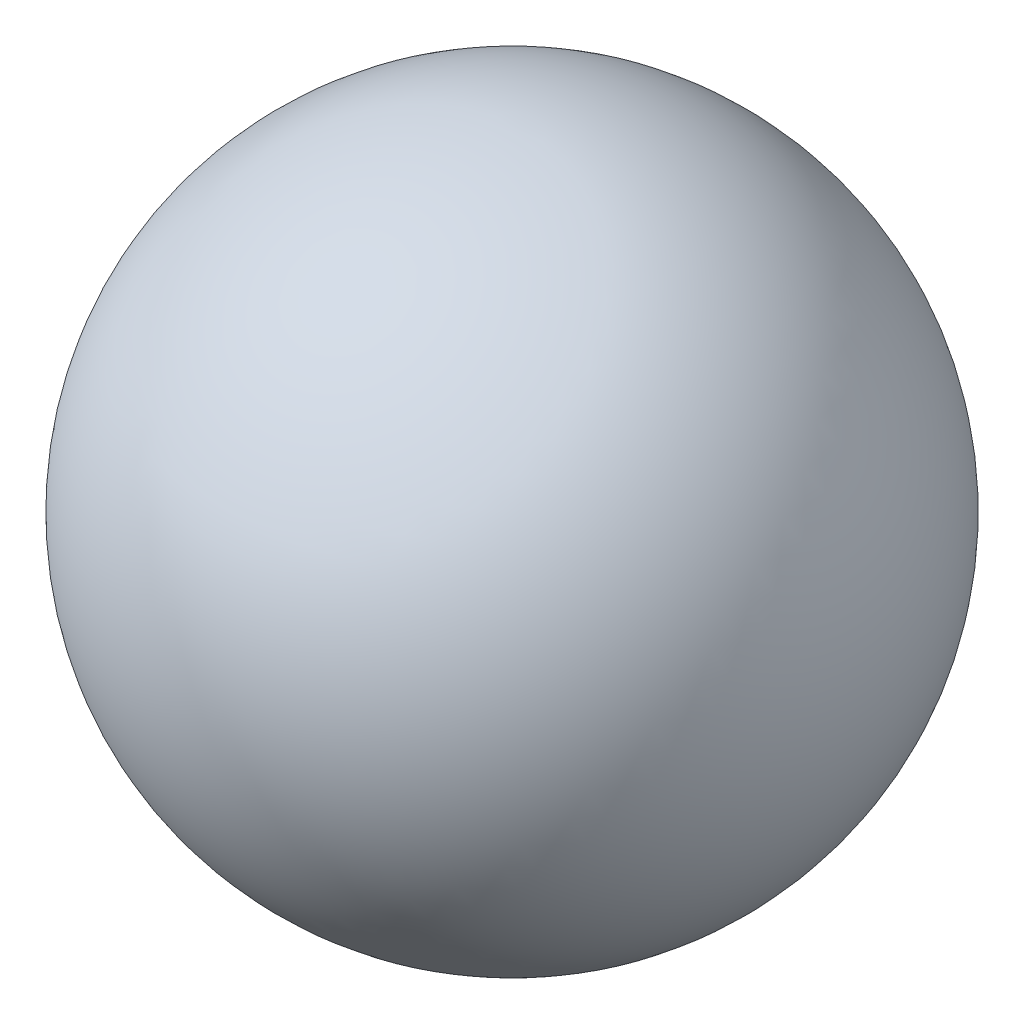
ISO-10303-21;
HEADER;
FILE_DESCRIPTION(('STEP AP214'),'2;1');
FILE_NAME('part.step','',(''),(''),'','','');
FILE_SCHEMA(('AUTOMOTIVE_DESIGN { 1 0 10303 214 1 1 1 1 }'));
ENDSEC;
DATA;
#1=APPLICATION_CONTEXT('core data for automotive mechanical design processes');
#2=APPLICATION_PROTOCOL_DEFINITION('international standard','automotive_design',2000,#1);
#3=PRODUCT_CONTEXT('',#1,'mechanical');
#4=PRODUCT('Part','Part','',(#3));
#5=PRODUCT_RELATED_PRODUCT_CATEGORY('part','',(#4));
#6=PRODUCT_DEFINITION_FORMATION('','',#4);
#7=PRODUCT_DEFINITION_CONTEXT('part definition',#1,'design');
#8=PRODUCT_DEFINITION('design','',#6,#7);
#9=PRODUCT_DEFINITION_SHAPE('','',#8);
#10=(LENGTH_UNIT() NAMED_UNIT(*) SI_UNIT(.MILLI.,.METRE.));
#11=(NAMED_UNIT(*) PLANE_ANGLE_UNIT() SI_UNIT($,.RADIAN.));
#12=(NAMED_UNIT(*) SI_UNIT($,.STERADIAN.) SOLID_ANGLE_UNIT());
#13=UNCERTAINTY_MEASURE_WITH_UNIT(LENGTH_MEASURE(1.E-05),#10,'distance_accuracy_value','');
#14=(GEOMETRIC_REPRESENTATION_CONTEXT(3) GLOBAL_UNCERTAINTY_ASSIGNED_CONTEXT((#13)) GLOBAL_UNIT_ASSIGNED_CONTEXT((#10,
#11,#12)) REPRESENTATION_CONTEXT('',''));
#15=CARTESIAN_POINT('',(0.,0.,0.));
#16=DIRECTION('',(0.,0.,1.));
#17=DIRECTION('',(1.,0.,0.));
#18=AXIS2_PLACEMENT_3D('',#15,#16,#17);
#19=CARTESIAN_POINT('',(0.,0.,0.));
#20=DIRECTION('',(0.,1.,0.));
#21=DIRECTION('',(1.,0.,0.));
#22=AXIS2_PLACEMENT_3D('',#19,#20,#21);
#23=SPHERICAL_SURFACE('',#22,3.5);
#24=CARTESIAN_POINT('',(0.,3.5,0.));
#25=VERTEX_POINT('',#24);
#26=VERTEX_LOOP('',#25);
#27=FACE_BOUND('',#26,.T.);
#28=ADVANCED_FACE('F39',(#27),#23,.T.);
#29=CLOSED_SHELL('',(#28));
#30=MANIFOLD_SOLID_BREP('B2',#29);
#31=ADVANCED_BREP_SHAPE_REPRESENTATION('',(#18,#30),#14);
#32=SHAPE_DEFINITION_REPRESENTATION(#9,#31);
ENDSEC;
END-ISO-10303-21;
